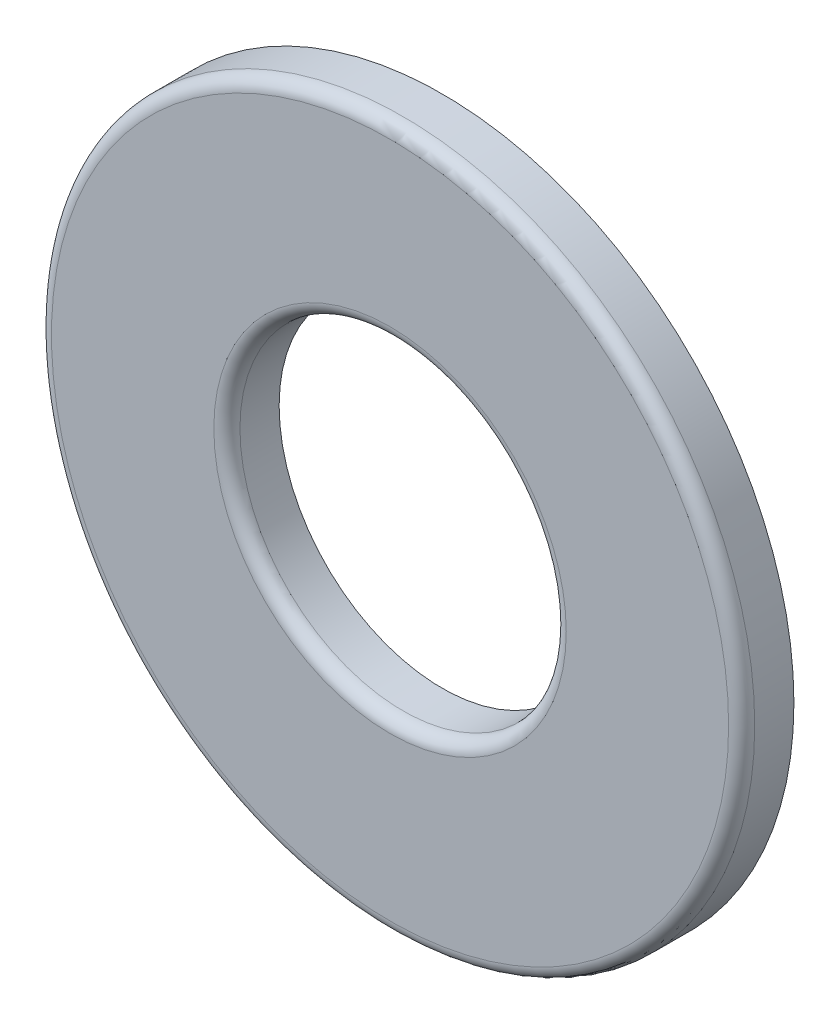
ISO-10303-21;
HEADER;
FILE_DESCRIPTION(('STEP AP214'),'2;1');
FILE_NAME('part.step','',(''),(''),'','','');
FILE_SCHEMA(('AUTOMOTIVE_DESIGN { 1 0 10303 214 1 1 1 1 }'));
ENDSEC;
DATA;
#1=APPLICATION_CONTEXT('core data for automotive mechanical design processes');
#2=APPLICATION_PROTOCOL_DEFINITION('international standard','automotive_design',2000,#1);
#3=PRODUCT_CONTEXT('',#1,'mechanical');
#4=PRODUCT('Part','Part','',(#3));
#5=PRODUCT_RELATED_PRODUCT_CATEGORY('part','',(#4));
#6=PRODUCT_DEFINITION_FORMATION('','',#4);
#7=PRODUCT_DEFINITION_CONTEXT('part definition',#1,'design');
#8=PRODUCT_DEFINITION('design','',#6,#7);
#9=PRODUCT_DEFINITION_SHAPE('','',#8);
#10=(LENGTH_UNIT() NAMED_UNIT(*) SI_UNIT(.MILLI.,.METRE.));
#11=(NAMED_UNIT(*) PLANE_ANGLE_UNIT() SI_UNIT($,.RADIAN.));
#12=(NAMED_UNIT(*) SI_UNIT($,.STERADIAN.) SOLID_ANGLE_UNIT());
#13=UNCERTAINTY_MEASURE_WITH_UNIT(LENGTH_MEASURE(1.E-05),#10,'distance_accuracy_value','');
#14=(GEOMETRIC_REPRESENTATION_CONTEXT(3) GLOBAL_UNCERTAINTY_ASSIGNED_CONTEXT((#13)) GLOBAL_UNIT_ASSIGNED_CONTEXT((#10,
#11,#12)) REPRESENTATION_CONTEXT('',''));
#15=CARTESIAN_POINT('',(0.,0.,0.));
#16=DIRECTION('',(0.,0.,1.));
#17=DIRECTION('',(1.,0.,0.));
#18=AXIS2_PLACEMENT_3D('',#15,#16,#17);
#19=CARTESIAN_POINT('',(0.,0.,0.412749999999997));
#20=DIRECTION('',(0.,0.,1.));
#21=DIRECTION('',(1.,0.,0.));
#22=AXIS2_PLACEMENT_3D('',#19,#20,#21);
#23=PLANE('',#22);
#24=CARTESIAN_POINT('',(0.,0.,0.412749999999997));
#25=DIRECTION('',(0.,0.,1.));
#26=DIRECTION('',(1.,0.,0.));
#27=AXIS2_PLACEMENT_3D('',#24,#25,#26);
#28=CIRCLE('',#27,5.349875);
#29=CARTESIAN_POINT('',(5.349875,0.,0.412749999999997));
#30=VERTEX_POINT('',#29);
#31=EDGE_CURVE('E61',#30,#30,#28,.T.);
#32=ORIENTED_EDGE('',*,*,#31,.T.);
#33=EDGE_LOOP('',(#32));
#34=FACE_BOUND('',#33,.T.);
#35=CARTESIAN_POINT('',(0.,0.,0.412749999999997));
#36=DIRECTION('',(0.,0.,1.));
#37=DIRECTION('',(1.,0.,0.));
#38=AXIS2_PLACEMENT_3D('',#35,#36,#37);
#39=CIRCLE('',#38,2.784475);
#40=CARTESIAN_POINT('',(2.784475,0.,0.412749999999997));
#41=VERTEX_POINT('',#40);
#42=EDGE_CURVE('E67',#41,#41,#39,.F.);
#43=ORIENTED_EDGE('',*,*,#42,.T.);
#44=EDGE_LOOP('',(#43));
#45=FACE_BOUND('',#44,.T.);
#46=ADVANCED_FACE('F47',(#34,#45),#23,.T.);
#47=CARTESIAN_POINT('',(0.,0.,0.412749999999997));
#48=DIRECTION('',(0.,0.,-1.));
#49=DIRECTION('',(-1.,0.,0.));
#50=AXIS2_PLACEMENT_3D('',#47,#48,#49);
#51=CYLINDRICAL_SURFACE('',#50,5.55625);
#52=CARTESIAN_POINT('',(0.,0.,0.206374999999997));
#53=DIRECTION('',(0.,0.,1.));
#54=DIRECTION('',(1.,0.,0.));
#55=AXIS2_PLACEMENT_3D('',#52,#53,#54);
#56=CIRCLE('',#55,5.55625);
#57=CARTESIAN_POINT('',(-5.55625,0.,0.206374999999997));
#58=VERTEX_POINT('',#57);
#59=EDGE_CURVE('E55',#58,#58,#56,.F.);
#60=CARTESIAN_POINT('',(0.,0.,-0.412750000000003));
#61=DIRECTION('',(0.,0.,1.));
#62=DIRECTION('',(1.,0.,0.));
#63=AXIS2_PLACEMENT_3D('',#60,#61,#62);
#64=CIRCLE('',#63,5.55625);
#65=CARTESIAN_POINT('',(-5.55625,0.,-0.412750000000003));
#66=VERTEX_POINT('',#65);
#67=EDGE_CURVE('E73',#66,#66,#64,.T.);
#68=CARTESIAN_POINT('',(-5.55625,0.,0.206374999999997));
#69=CARTESIAN_POINT('',(-5.55625,0.,0.199925781249997));
#70=CARTESIAN_POINT('',(-5.55625,0.,0.193476562499997));
#71=CARTESIAN_POINT('',(-5.55625,0.,0.180578124999997));
#72=CARTESIAN_POINT('',(-5.55625,0.,0.174128906249997));
#73=CARTESIAN_POINT('',(-5.55625,0.,0.161230468749997));
#74=CARTESIAN_POINT('',(-5.55625,0.,0.154781249999997));
#75=CARTESIAN_POINT('',(-5.55625,0.,0.141882812499997));
#76=CARTESIAN_POINT('',(-5.55625,0.,0.135433593749997));
#77=CARTESIAN_POINT('',(-5.55625,0.,0.122535156249997));
#78=CARTESIAN_POINT('',(-5.55625,0.,0.116085937499997));
#79=CARTESIAN_POINT('',(-5.55625,0.,0.103187499999997));
#80=CARTESIAN_POINT('',(-5.55625,0.,0.0967382812499969));
#81=CARTESIAN_POINT('',(-5.55625,0.,0.0838398437499969));
#82=CARTESIAN_POINT('',(-5.55625,0.,0.0773906249999969));
#83=CARTESIAN_POINT('',(-5.55625,0.,0.0644921874999969));
#84=CARTESIAN_POINT('',(-5.55625,0.,0.0580429687499969));
#85=CARTESIAN_POINT('',(-5.55625,0.,0.0451445312499969));
#86=CARTESIAN_POINT('',(-5.55625,0.,0.0386953124999969));
#87=CARTESIAN_POINT('',(-5.55625,0.,0.0257968749999969));
#88=CARTESIAN_POINT('',(-5.55625,0.,0.0193476562499969));
#89=CARTESIAN_POINT('',(-5.55625,0.,0.00644921874999689));
#90=CARTESIAN_POINT('',(-5.55625,0.,0.));
#91=CARTESIAN_POINT('',(-5.55625,0.,-0.0128984375000031));
#92=CARTESIAN_POINT('',(-5.55625,0.,-0.0193476562500031));
#93=CARTESIAN_POINT('',(-5.55625,0.,-0.0322460937500031));
#94=CARTESIAN_POINT('',(-5.55625,0.,-0.0386953125000031));
#95=CARTESIAN_POINT('',(-5.55625,0.,-0.0515937500000031));
#96=CARTESIAN_POINT('',(-5.55625,0.,-0.0580429687500031));
#97=CARTESIAN_POINT('',(-5.55625,0.,-0.0709414062500031));
#98=CARTESIAN_POINT('',(-5.55625,0.,-0.0773906250000031));
#99=CARTESIAN_POINT('',(-5.55625,0.,-0.0902890625000031));
#100=CARTESIAN_POINT('',(-5.55625,0.,-0.0967382812500031));
#101=CARTESIAN_POINT('',(-5.55625,0.,-0.109636718750003));
#102=CARTESIAN_POINT('',(-5.55625,0.,-0.116085937500003));
#103=CARTESIAN_POINT('',(-5.55625,0.,-0.128984375000003));
#104=CARTESIAN_POINT('',(-5.55625,0.,-0.135433593750003));
#105=CARTESIAN_POINT('',(-5.55625,0.,-0.148332031250003));
#106=CARTESIAN_POINT('',(-5.55625,0.,-0.154781250000003));
#107=CARTESIAN_POINT('',(-5.55625,0.,-0.167679687500003));
#108=CARTESIAN_POINT('',(-5.55625,0.,-0.174128906250003));
#109=CARTESIAN_POINT('',(-5.55625,0.,-0.187027343750003));
#110=CARTESIAN_POINT('',(-5.55625,0.,-0.193476562500003));
#111=CARTESIAN_POINT('',(-5.55625,0.,-0.206375000000003));
#112=CARTESIAN_POINT('',(-5.55625,0.,-0.212824218750003));
#113=CARTESIAN_POINT('',(-5.55625,0.,-0.225722656250003));
#114=CARTESIAN_POINT('',(-5.55625,0.,-0.232171875000003));
#115=CARTESIAN_POINT('',(-5.55625,0.,-0.245070312500003));
#116=CARTESIAN_POINT('',(-5.55625,0.,-0.251519531250003));
#117=CARTESIAN_POINT('',(-5.55625,0.,-0.264417968750003));
#118=CARTESIAN_POINT('',(-5.55625,0.,-0.270867187500003));
#119=CARTESIAN_POINT('',(-5.55625,0.,-0.283765625000003));
#120=CARTESIAN_POINT('',(-5.55625,0.,-0.290214843750003));
#121=CARTESIAN_POINT('',(-5.55625,0.,-0.303113281250003));
#122=CARTESIAN_POINT('',(-5.55625,0.,-0.309562500000003));
#123=CARTESIAN_POINT('',(-5.55625,0.,-0.322460937500003));
#124=CARTESIAN_POINT('',(-5.55625,0.,-0.328910156250003));
#125=CARTESIAN_POINT('',(-5.55625,0.,-0.341808593750003));
#126=CARTESIAN_POINT('',(-5.55625,0.,-0.348257812500003));
#127=CARTESIAN_POINT('',(-5.55625,0.,-0.361156250000003));
#128=CARTESIAN_POINT('',(-5.55625,0.,-0.367605468750003));
#129=CARTESIAN_POINT('',(-5.55625,0.,-0.380503906250003));
#130=CARTESIAN_POINT('',(-5.55625,0.,-0.386953125000003));
#131=CARTESIAN_POINT('',(-5.55625,0.,-0.399851562500003));
#132=CARTESIAN_POINT('',(-5.55625,0.,-0.406300781250003));
#133=CARTESIAN_POINT('',(-5.55625,0.,-0.412750000000003));
#134=B_SPLINE_CURVE_WITH_KNOTS('',3,(#68,#69,#70,#71,#72,#73,#74,#75,#76,#77,#78,#79,#80,#81,
#82,#83,#84,#85,#86,#87,#88,#89,#90,#91,#92,#93,#94,#95,#96,#97,#98,#99,#100,#101,#102,#103,
#104,#105,#106,#107,#108,#109,#110,#111,#112,#113,#114,#115,#116,#117,#118,#119,#120,#121,#122,
#123,#124,#125,#126,#127,#128,#129,#130,#131,#132,#133),.UNSPECIFIED.,.F.,.F.,(4,2,2,2,2,2,2,2,
2,2,2,2,2,2,2,2,2,2,2,2,2,2,2,2,2,2,2,2,2,2,2,2,4),(0.,0.01934765625,0.0386953125,0.05804296875,
0.077390625,0.09673828125,0.1160859375,0.13543359375,0.15478125,0.17412890625,0.1934765625,
0.21282421875,0.232171875,0.25151953125,0.2708671875,0.29021484375,0.3095625,0.32891015625,
0.3482578125,0.36760546875,0.386953125,0.40630078125,0.4256484375,0.44499609375,0.46434375,
0.48369140625,0.5030390625,0.52238671875,0.541734375,0.56108203125,0.5804296875,0.59977734375,
0.619125),.UNSPECIFIED.);
#135=EDGE_CURVE('BSEAM88',#58,#66,#134,.T.);
#136=ORIENTED_EDGE('',*,*,#59,.T.);
#137=ORIENTED_EDGE('',*,*,#67,.T.);
#138=ORIENTED_EDGE('',*,*,#135,.T.);
#139=ORIENTED_EDGE('',*,*,#135,.F.);
#140=EDGE_LOOP('',(#136,#138,#137,#139));
#141=FACE_BOUND('',#140,.T.);
#142=ADVANCED_FACE('F88',(#141),#51,.T.);
#143=CARTESIAN_POINT('',(0.,0.,0.412749999999997));
#144=DIRECTION('',(0.,0.,-1.));
#145=DIRECTION('',(-1.,0.,0.));
#146=AXIS2_PLACEMENT_3D('',#143,#144,#145);
#147=CYLINDRICAL_SURFACE('',#146,2.5781);
#148=CARTESIAN_POINT('',(0.,0.,0.206374999999997));
#149=DIRECTION('',(0.,0.,1.));
#150=DIRECTION('',(1.,0.,0.));
#151=AXIS2_PLACEMENT_3D('',#148,#149,#150);
#152=CIRCLE('',#151,2.5781);
#153=CARTESIAN_POINT('',(-2.5781,0.,0.206374999999997));
#154=VERTEX_POINT('',#153);
#155=EDGE_CURVE('E10',#154,#154,#152,.T.);
#156=CARTESIAN_POINT('',(0.,0.,-0.412750000000003));
#157=DIRECTION('',(0.,0.,1.));
#158=DIRECTION('',(1.,0.,0.));
#159=AXIS2_PLACEMENT_3D('',#156,#157,#158);
#160=CIRCLE('',#159,2.5781);
#161=CARTESIAN_POINT('',(-2.5781,0.,-0.412750000000003));
#162=VERTEX_POINT('',#161);
#163=EDGE_CURVE('E77',#162,#162,#160,.T.);
#164=CARTESIAN_POINT('',(-2.5781,0.,0.206374999999997));
#165=CARTESIAN_POINT('',(-2.5781,0.,0.199925781249997));
#166=CARTESIAN_POINT('',(-2.5781,0.,0.193476562499997));
#167=CARTESIAN_POINT('',(-2.5781,0.,0.180578124999997));
#168=CARTESIAN_POINT('',(-2.5781,0.,0.174128906249997));
#169=CARTESIAN_POINT('',(-2.5781,0.,0.161230468749997));
#170=CARTESIAN_POINT('',(-2.5781,0.,0.154781249999997));
#171=CARTESIAN_POINT('',(-2.5781,0.,0.141882812499997));
#172=CARTESIAN_POINT('',(-2.5781,0.,0.135433593749997));
#173=CARTESIAN_POINT('',(-2.5781,0.,0.122535156249997));
#174=CARTESIAN_POINT('',(-2.5781,0.,0.116085937499997));
#175=CARTESIAN_POINT('',(-2.5781,0.,0.103187499999997));
#176=CARTESIAN_POINT('',(-2.5781,0.,0.0967382812499969));
#177=CARTESIAN_POINT('',(-2.5781,0.,0.0838398437499969));
#178=CARTESIAN_POINT('',(-2.5781,0.,0.0773906249999969));
#179=CARTESIAN_POINT('',(-2.5781,0.,0.0644921874999969));
#180=CARTESIAN_POINT('',(-2.5781,0.,0.0580429687499969));
#181=CARTESIAN_POINT('',(-2.5781,0.,0.0451445312499969));
#182=CARTESIAN_POINT('',(-2.5781,0.,0.0386953124999969));
#183=CARTESIAN_POINT('',(-2.5781,0.,0.0257968749999969));
#184=CARTESIAN_POINT('',(-2.5781,0.,0.0193476562499969));
#185=CARTESIAN_POINT('',(-2.5781,0.,0.00644921874999689));
#186=CARTESIAN_POINT('',(-2.5781,0.,0.));
#187=CARTESIAN_POINT('',(-2.5781,0.,-0.0128984375000031));
#188=CARTESIAN_POINT('',(-2.5781,0.,-0.0193476562500031));
#189=CARTESIAN_POINT('',(-2.5781,0.,-0.0322460937500031));
#190=CARTESIAN_POINT('',(-2.5781,0.,-0.0386953125000031));
#191=CARTESIAN_POINT('',(-2.5781,0.,-0.0515937500000031));
#192=CARTESIAN_POINT('',(-2.5781,0.,-0.0580429687500031));
#193=CARTESIAN_POINT('',(-2.5781,0.,-0.0709414062500031));
#194=CARTESIAN_POINT('',(-2.5781,0.,-0.0773906250000031));
#195=CARTESIAN_POINT('',(-2.5781,0.,-0.0902890625000031));
#196=CARTESIAN_POINT('',(-2.5781,0.,-0.0967382812500031));
#197=CARTESIAN_POINT('',(-2.5781,0.,-0.109636718750003));
#198=CARTESIAN_POINT('',(-2.5781,0.,-0.116085937500003));
#199=CARTESIAN_POINT('',(-2.5781,0.,-0.128984375000003));
#200=CARTESIAN_POINT('',(-2.5781,0.,-0.135433593750003));
#201=CARTESIAN_POINT('',(-2.5781,0.,-0.148332031250003));
#202=CARTESIAN_POINT('',(-2.5781,0.,-0.154781250000003));
#203=CARTESIAN_POINT('',(-2.5781,0.,-0.167679687500003));
#204=CARTESIAN_POINT('',(-2.5781,0.,-0.174128906250003));
#205=CARTESIAN_POINT('',(-2.5781,0.,-0.187027343750003));
#206=CARTESIAN_POINT('',(-2.5781,0.,-0.193476562500003));
#207=CARTESIAN_POINT('',(-2.5781,0.,-0.206375000000003));
#208=CARTESIAN_POINT('',(-2.5781,0.,-0.212824218750003));
#209=CARTESIAN_POINT('',(-2.5781,0.,-0.225722656250003));
#210=CARTESIAN_POINT('',(-2.5781,0.,-0.232171875000003));
#211=CARTESIAN_POINT('',(-2.5781,0.,-0.245070312500003));
#212=CARTESIAN_POINT('',(-2.5781,0.,-0.251519531250003));
#213=CARTESIAN_POINT('',(-2.5781,0.,-0.264417968750003));
#214=CARTESIAN_POINT('',(-2.5781,0.,-0.270867187500003));
#215=CARTESIAN_POINT('',(-2.5781,0.,-0.283765625000003));
#216=CARTESIAN_POINT('',(-2.5781,0.,-0.290214843750003));
#217=CARTESIAN_POINT('',(-2.5781,0.,-0.303113281250003));
#218=CARTESIAN_POINT('',(-2.5781,0.,-0.309562500000003));
#219=CARTESIAN_POINT('',(-2.5781,0.,-0.322460937500003));
#220=CARTESIAN_POINT('',(-2.5781,0.,-0.328910156250003));
#221=CARTESIAN_POINT('',(-2.5781,0.,-0.341808593750003));
#222=CARTESIAN_POINT('',(-2.5781,0.,-0.348257812500003));
#223=CARTESIAN_POINT('',(-2.5781,0.,-0.361156250000003));
#224=CARTESIAN_POINT('',(-2.5781,0.,-0.367605468750003));
#225=CARTESIAN_POINT('',(-2.5781,0.,-0.380503906250003));
#226=CARTESIAN_POINT('',(-2.5781,0.,-0.386953125000003));
#227=CARTESIAN_POINT('',(-2.5781,0.,-0.399851562500003));
#228=CARTESIAN_POINT('',(-2.5781,0.,-0.406300781250003));
#229=CARTESIAN_POINT('',(-2.5781,0.,-0.412750000000003));
#230=B_SPLINE_CURVE_WITH_KNOTS('',3,(#164,#165,#166,#167,#168,#169,#170,#171,#172,#173,#174,
#175,#176,#177,#178,#179,#180,#181,#182,#183,#184,#185,#186,#187,#188,#189,#190,#191,#192,#193,
#194,#195,#196,#197,#198,#199,#200,#201,#202,#203,#204,#205,#206,#207,#208,#209,#210,#211,#212,
#213,#214,#215,#216,#217,#218,#219,#220,#221,#222,#223,#224,#225,#226,#227,#228,#229),
.UNSPECIFIED.,.F.,.F.,(4,2,2,2,2,2,2,2,2,2,2,2,2,2,2,2,2,2,2,2,2,2,2,2,2,2,2,2,2,2,2,2,4),(0.,
0.01934765625,0.0386953125,0.05804296875,0.077390625,0.09673828125,0.1160859375,0.13543359375,
0.15478125,0.17412890625,0.1934765625,0.21282421875,0.232171875,0.25151953125,0.2708671875,
0.29021484375,0.3095625,0.32891015625,0.3482578125,0.36760546875,0.386953125,0.40630078125,
0.4256484375,0.44499609375,0.46434375,0.48369140625,0.5030390625,0.52238671875,0.541734375,
0.56108203125,0.5804296875,0.59977734375,0.619125),.UNSPECIFIED.);
#231=EDGE_CURVE('BSEAM86',#154,#162,#230,.T.);
#232=ORIENTED_EDGE('',*,*,#155,.T.);
#233=ORIENTED_EDGE('',*,*,#163,.F.);
#234=ORIENTED_EDGE('',*,*,#231,.T.);
#235=ORIENTED_EDGE('',*,*,#231,.F.);
#236=EDGE_LOOP('',(#232,#234,#233,#235));
#237=FACE_BOUND('',#236,.T.);
#238=ADVANCED_FACE('F86',(#237),#147,.F.);
#239=CARTESIAN_POINT('',(0.,0.,-0.412750000000003));
#240=DIRECTION('',(0.,0.,1.));
#241=DIRECTION('',(1.,0.,0.));
#242=AXIS2_PLACEMENT_3D('',#239,#240,#241);
#243=PLANE('',#242);
#244=ORIENTED_EDGE('',*,*,#163,.T.);
#245=EDGE_LOOP('',(#244));
#246=FACE_BOUND('',#245,.T.);
#247=ORIENTED_EDGE('',*,*,#67,.F.);
#248=EDGE_LOOP('',(#247));
#249=FACE_BOUND('',#248,.T.);
#250=ADVANCED_FACE('F83',(#246,#249),#243,.F.);
#251=CARTESIAN_POINT('',(0.,0.,0.206374999999997));
#252=DIRECTION('',(0.,0.,1.));
#253=DIRECTION('',(1.,0.,0.));
#254=AXIS2_PLACEMENT_3D('',#251,#252,#253);
#255=TOROIDAL_SURFACE('',#254,5.349875,0.206375);
#256=ORIENTED_EDGE('',*,*,#59,.F.);
#257=EDGE_LOOP('',(#256));
#258=FACE_BOUND('',#257,.T.);
#259=ORIENTED_EDGE('',*,*,#31,.F.);
#260=EDGE_LOOP('',(#259));
#261=FACE_BOUND('',#260,.T.);
#262=ADVANCED_FACE('F94',(#258,#261),#255,.T.);
#263=CARTESIAN_POINT('',(0.,0.,0.206374999999997));
#264=DIRECTION('',(0.,0.,1.));
#265=DIRECTION('',(1.,0.,0.));
#266=AXIS2_PLACEMENT_3D('',#263,#264,#265);
#267=TOROIDAL_SURFACE('',#266,2.784475,0.206375);
#268=ORIENTED_EDGE('',*,*,#42,.F.);
#269=EDGE_LOOP('',(#268));
#270=FACE_BOUND('',#269,.T.);
#271=ORIENTED_EDGE('',*,*,#155,.F.);
#272=EDGE_LOOP('',(#271));
#273=FACE_BOUND('',#272,.T.);
#274=ADVANCED_FACE('F49',(#270,#273),#267,.T.);
#275=CLOSED_SHELL('',(#46,#142,#238,#250,#262,#274));
#276=MANIFOLD_SOLID_BREP('B2',#275);
#277=ADVANCED_BREP_SHAPE_REPRESENTATION('',(#18,#276),#14);
#278=SHAPE_DEFINITION_REPRESENTATION(#9,#277);
ENDSEC;
END-ISO-10303-21;
